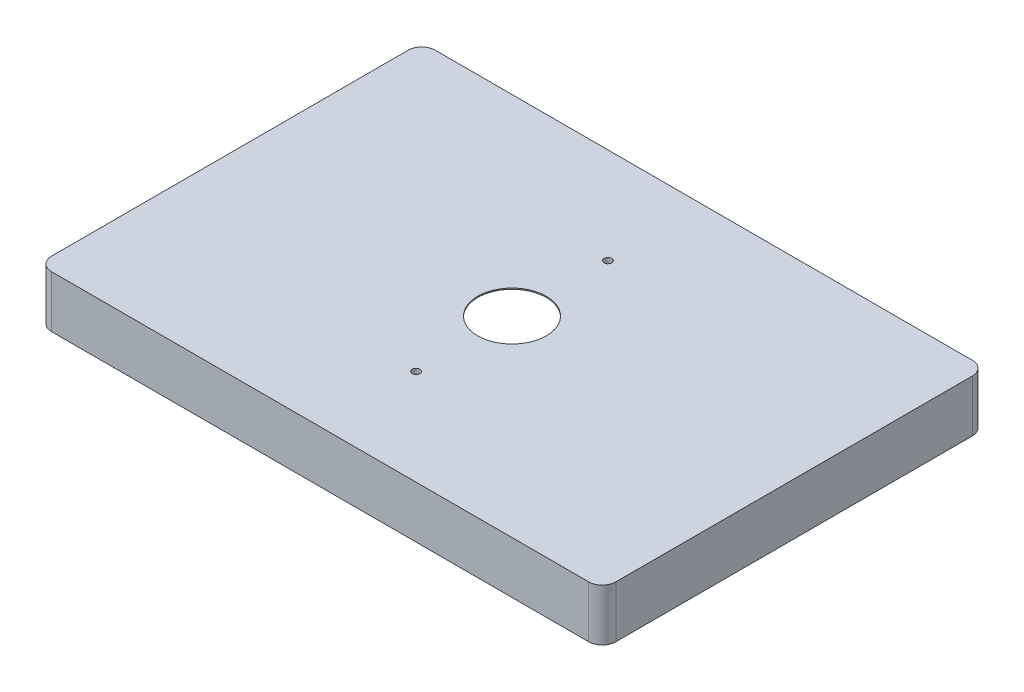
ISO-10303-21;
HEADER;
FILE_DESCRIPTION(('STEP AP214'),'2;1');
FILE_NAME('part.step','',(''),(''),'','','');
FILE_SCHEMA(('AUTOMOTIVE_DESIGN { 1 0 10303 214 1 1 1 1 }'));
ENDSEC;
DATA;
#1=APPLICATION_CONTEXT('core data for automotive mechanical design processes');
#2=APPLICATION_PROTOCOL_DEFINITION('international standard','automotive_design',2000,#1);
#3=PRODUCT_CONTEXT('',#1,'mechanical');
#4=PRODUCT('Part','Part','',(#3));
#5=PRODUCT_RELATED_PRODUCT_CATEGORY('part','',(#4));
#6=PRODUCT_DEFINITION_FORMATION('','',#4);
#7=PRODUCT_DEFINITION_CONTEXT('part definition',#1,'design');
#8=PRODUCT_DEFINITION('design','',#6,#7);
#9=PRODUCT_DEFINITION_SHAPE('','',#8);
#10=(LENGTH_UNIT() NAMED_UNIT(*) SI_UNIT(.MILLI.,.METRE.));
#11=(NAMED_UNIT(*) PLANE_ANGLE_UNIT() SI_UNIT($,.RADIAN.));
#12=(NAMED_UNIT(*) SI_UNIT($,.STERADIAN.) SOLID_ANGLE_UNIT());
#13=UNCERTAINTY_MEASURE_WITH_UNIT(LENGTH_MEASURE(1.E-05),#10,'distance_accuracy_value','');
#14=(GEOMETRIC_REPRESENTATION_CONTEXT(3) GLOBAL_UNCERTAINTY_ASSIGNED_CONTEXT((#13)) GLOBAL_UNIT_ASSIGNED_CONTEXT((#10,
#11,#12)) REPRESENTATION_CONTEXT('',''));
#15=CARTESIAN_POINT('',(0.,0.,0.));
#16=DIRECTION('',(0.,0.,1.));
#17=DIRECTION('',(1.,0.,0.));
#18=AXIS2_PLACEMENT_3D('',#15,#16,#17);
#19=CARTESIAN_POINT('',(0.,-10.,0.));
#20=DIRECTION('',(0.,1.,0.));
#21=DIRECTION('',(0.,0.,1.));
#22=AXIS2_PLACEMENT_3D('',#19,#20,#21);
#23=PLANE('',#22);
#24=CARTESIAN_POINT('',(0.,-10.,-42.5));
#25=DIRECTION('',(0.,-1.,0.));
#26=DIRECTION('',(0.,0.,-1.));
#27=AXIS2_PLACEMENT_3D('',#24,#25,#26);
#28=CIRCLE('',#27,3.36);
#29=CARTESIAN_POINT('',(0.,-10.,-45.86));
#30=VERTEX_POINT('',#29);
#31=EDGE_CURVE('E376',#30,#30,#28,.T.);
#32=ORIENTED_EDGE('',*,*,#31,.F.);
#33=EDGE_LOOP('',(#32));
#34=FACE_BOUND('',#33,.T.);
#35=CARTESIAN_POINT('',(0.,-10.,42.5));
#36=DIRECTION('',(0.,-1.,0.));
#37=DIRECTION('',(0.,0.,-1.));
#38=AXIS2_PLACEMENT_3D('',#35,#36,#37);
#39=CIRCLE('',#38,3.36);
#40=CARTESIAN_POINT('',(0.,-10.,39.14));
#41=VERTEX_POINT('',#40);
#42=EDGE_CURVE('E395',#41,#41,#39,.T.);
#43=ORIENTED_EDGE('',*,*,#42,.F.);
#44=EDGE_LOOP('',(#43));
#45=FACE_BOUND('',#44,.T.);
#46=CARTESIAN_POINT('',(4.9586776859504,-10.,0.));
#47=DIRECTION('',(0.,1.,0.));
#48=DIRECTION('',(0.,0.,1.));
#49=AXIS2_PLACEMENT_3D('',#46,#47,#48);
#50=CIRCLE('',#49,35.407046623984);
#51=CARTESIAN_POINT('',(-0.815382984620259,-10.,-34.9330670569526));
#52=VERTEX_POINT('',#51);
#53=CARTESIAN_POINT('',(-0.815382984620264,-10.,34.9330670569526));
#54=VERTEX_POINT('',#53);
#55=EDGE_CURVE('E237',#52,#54,#50,.T.);
#56=ORIENTED_EDGE('',*,*,#55,.T.);
#57=DIRECTION('',(0.986613411390535,0.,0.163076596924055));
#58=VECTOR('',#57,1.);
#59=CARTESIAN_POINT('',(-5.64218971289631,-10.,34.1352477630227));
#60=LINE('',#59,#58);
#61=CARTESIAN_POINT('',(121.,-10.,55.0678411039973));
#62=VERTEX_POINT('',#61);
#63=EDGE_CURVE('E232',#54,#62,#60,.T.);
#64=ORIENTED_EDGE('',*,*,#63,.T.);
#65=DIRECTION('',(0.,0.,1.));
#66=VECTOR('',#65,1.);
#67=CARTESIAN_POINT('',(121.,-10.,0.));
#68=LINE('',#67,#66);
#69=CARTESIAN_POINT('',(121.,-10.,79.));
#70=VERTEX_POINT('',#69);
#71=EDGE_CURVE('E236',#62,#70,#68,.T.);
#72=ORIENTED_EDGE('',*,*,#71,.T.);
#73=CARTESIAN_POINT('',(119.,-10.,79.));
#74=DIRECTION('',(0.,-1.,0.));
#75=DIRECTION('',(0.,0.,-1.));
#76=AXIS2_PLACEMENT_3D('',#73,#74,#75);
#77=CIRCLE('',#76,2.);
#78=CARTESIAN_POINT('',(119.,-10.,81.));
#79=VERTEX_POINT('',#78);
#80=EDGE_CURVE('E254',#70,#79,#77,.T.);
#81=ORIENTED_EDGE('',*,*,#80,.T.);
#82=DIRECTION('',(-1.,0.,0.));
#83=VECTOR('',#82,1.);
#84=CARTESIAN_POINT('',(0.,-10.,81.));
#85=LINE('',#84,#83);
#86=CARTESIAN_POINT('',(-119.,-10.,81.));
#87=VERTEX_POINT('',#86);
#88=EDGE_CURVE('E484',#79,#87,#85,.T.);
#89=ORIENTED_EDGE('',*,*,#88,.T.);
#90=CARTESIAN_POINT('',(-119.,-10.,79.));
#91=DIRECTION('',(0.,-1.,0.));
#92=DIRECTION('',(0.,0.,-1.));
#93=AXIS2_PLACEMENT_3D('',#90,#91,#92);
#94=CIRCLE('',#93,2.);
#95=CARTESIAN_POINT('',(-121.,-10.,79.));
#96=VERTEX_POINT('',#95);
#97=EDGE_CURVE('E483',#96,#87,#94,.F.);
#98=ORIENTED_EDGE('',*,*,#97,.F.);
#99=DIRECTION('',(0.,0.,-1.));
#100=VECTOR('',#99,1.);
#101=CARTESIAN_POINT('',(-121.,-10.,0.));
#102=LINE('',#101,#100);
#103=CARTESIAN_POINT('',(-121.,-10.,-78.9999999999999));
#104=VERTEX_POINT('',#103);
#105=EDGE_CURVE('E418',#96,#104,#102,.T.);
#106=ORIENTED_EDGE('',*,*,#105,.T.);
#107=CARTESIAN_POINT('',(-119.,-10.,-78.9999999999999));
#108=DIRECTION('',(0.,-1.,0.));
#109=DIRECTION('',(0.,0.,-1.));
#110=AXIS2_PLACEMENT_3D('',#107,#108,#109);
#111=CIRCLE('',#110,2.);
#112=CARTESIAN_POINT('',(-119.,-10.,-80.9999999999999));
#113=VERTEX_POINT('',#112);
#114=EDGE_CURVE('E423',#104,#113,#111,.T.);
#115=ORIENTED_EDGE('',*,*,#114,.T.);
#116=DIRECTION('',(1.,0.,0.));
#117=VECTOR('',#116,1.);
#118=CARTESIAN_POINT('',(0.,-10.,-81.));
#119=LINE('',#118,#117);
#120=CARTESIAN_POINT('',(119.,-10.,-81.));
#121=VERTEX_POINT('',#120);
#122=EDGE_CURVE('E495',#113,#121,#119,.T.);
#123=ORIENTED_EDGE('',*,*,#122,.T.);
#124=CARTESIAN_POINT('',(119.,-10.,-79.));
#125=DIRECTION('',(0.,-1.,0.));
#126=DIRECTION('',(0.,0.,-1.));
#127=AXIS2_PLACEMENT_3D('',#124,#125,#126);
#128=CIRCLE('',#127,2.);
#129=CARTESIAN_POINT('',(121.,-10.,-79.));
#130=VERTEX_POINT('',#129);
#131=EDGE_CURVE('E490',#121,#130,#128,.T.);
#132=ORIENTED_EDGE('',*,*,#131,.T.);
#133=CARTESIAN_POINT('',(121.,-10.,-55.0678411039973));
#134=VERTEX_POINT('',#133);
#135=EDGE_CURVE('E255',#130,#134,#68,.T.);
#136=ORIENTED_EDGE('',*,*,#135,.T.);
#137=DIRECTION('',(-0.986613411390535,0.,0.163076596924055));
#138=VECTOR('',#137,1.);
#139=CARTESIAN_POINT('',(-5.64218971289631,-10.,-34.1352477630227));
#140=LINE('',#139,#138);
#141=EDGE_CURVE('E244',#134,#52,#140,.T.);
#142=ORIENTED_EDGE('',*,*,#141,.T.);
#143=EDGE_LOOP('',(#56,#64,#72,#81,#89,#98,#106,#115,#123,#132,#136,#142));
#144=FACE_BOUND('',#143,.T.);
#145=ADVANCED_FACE('F49',(#34,#45,#144),#23,.F.);
#146=CARTESIAN_POINT('',(-125.,-10.,85.));
#147=DIRECTION('',(-1.,0.,0.));
#148=DIRECTION('',(0.,0.,1.));
#149=AXIS2_PLACEMENT_3D('',#146,#147,#148);
#150=PLANE('',#149);
#151=DIRECTION('',(0.,0.,1.));
#152=VECTOR('',#151,1.);
#153=CARTESIAN_POINT('',(-125.,0.,85.));
#154=LINE('',#153,#152);
#155=CARTESIAN_POINT('',(-125.,0.,-78.9999999999999));
#156=VERTEX_POINT('',#155);
#157=CARTESIAN_POINT('',(-125.,0.,79.));
#158=VERTEX_POINT('',#157);
#159=EDGE_CURVE('E526',#156,#158,#154,.T.);
#160=ORIENTED_EDGE('',*,*,#159,.F.);
#161=DIRECTION('',(0.,1.,0.));
#162=VECTOR('',#161,1.);
#163=CARTESIAN_POINT('',(-125.,-10.,-78.9999999999999));
#164=LINE('',#163,#162);
#165=CARTESIAN_POINT('',(-125.,-23.,-78.9999999999999));
#166=VERTEX_POINT('',#165);
#167=EDGE_CURVE('E570',#156,#166,#164,.F.);
#168=ORIENTED_EDGE('',*,*,#167,.T.);
#169=DIRECTION('',(0.,0.,-1.));
#170=VECTOR('',#169,1.);
#171=CARTESIAN_POINT('',(-125.,-23.,0.));
#172=LINE('',#171,#170);
#173=CARTESIAN_POINT('',(-125.,-23.,79.));
#174=VERTEX_POINT('',#173);
#175=EDGE_CURVE('E417',#174,#166,#172,.T.);
#176=ORIENTED_EDGE('',*,*,#175,.F.);
#177=DIRECTION('',(0.,1.,0.));
#178=VECTOR('',#177,1.);
#179=CARTESIAN_POINT('',(-125.,-10.,79.));
#180=LINE('',#179,#178);
#181=EDGE_CURVE('E563',#174,#158,#180,.T.);
#182=ORIENTED_EDGE('',*,*,#181,.T.);
#183=EDGE_LOOP('',(#160,#168,#176,#182));
#184=FACE_BOUND('',#183,.T.);
#185=ADVANCED_FACE('F624',(#184),#150,.T.);
#186=CARTESIAN_POINT('',(125.,-10.,-85.));
#187=DIRECTION('',(0.,0.,-1.));
#188=DIRECTION('',(-1.,0.,0.));
#189=AXIS2_PLACEMENT_3D('',#186,#187,#188);
#190=PLANE('',#189);
#191=DIRECTION('',(0.,1.,0.));
#192=VECTOR('',#191,1.);
#193=CARTESIAN_POINT('',(119.,-10.,-85.));
#194=LINE('',#193,#192);
#195=CARTESIAN_POINT('',(119.,0.,-85.));
#196=VERTEX_POINT('',#195);
#197=CARTESIAN_POINT('',(119.,-23.,-85.));
#198=VERTEX_POINT('',#197);
#199=EDGE_CURVE('E544',#196,#198,#194,.F.);
#200=ORIENTED_EDGE('',*,*,#199,.T.);
#201=DIRECTION('',(1.,0.,0.));
#202=VECTOR('',#201,1.);
#203=CARTESIAN_POINT('',(0.,-23.,-85.));
#204=LINE('',#203,#202);
#205=CARTESIAN_POINT('',(-119.,-23.,-85.));
#206=VERTEX_POINT('',#205);
#207=EDGE_CURVE('E426',#206,#198,#204,.T.);
#208=ORIENTED_EDGE('',*,*,#207,.F.);
#209=DIRECTION('',(0.,1.,0.));
#210=VECTOR('',#209,1.);
#211=CARTESIAN_POINT('',(-119.,-10.,-85.));
#212=LINE('',#211,#210);
#213=CARTESIAN_POINT('',(-119.,0.,-85.));
#214=VERTEX_POINT('',#213);
#215=EDGE_CURVE('E550',#206,#214,#212,.T.);
#216=ORIENTED_EDGE('',*,*,#215,.T.);
#217=DIRECTION('',(-1.,0.,0.));
#218=VECTOR('',#217,1.);
#219=CARTESIAN_POINT('',(125.,0.,-85.));
#220=LINE('',#219,#218);
#221=EDGE_CURVE('E538',#196,#214,#220,.T.);
#222=ORIENTED_EDGE('',*,*,#221,.F.);
#223=EDGE_LOOP('',(#200,#208,#216,#222));
#224=FACE_BOUND('',#223,.T.);
#225=ADVANCED_FACE('F627',(#224),#190,.T.);
#226=CARTESIAN_POINT('',(125.,-10.,85.));
#227=DIRECTION('',(1.,0.,0.));
#228=DIRECTION('',(0.,0.,-1.));
#229=AXIS2_PLACEMENT_3D('',#226,#227,#228);
#230=PLANE('',#229);
#231=DIRECTION('',(0.,0.,-1.));
#232=VECTOR('',#231,1.);
#233=CARTESIAN_POINT('',(125.,0.,85.));
#234=LINE('',#233,#232);
#235=CARTESIAN_POINT('',(125.,0.,79.));
#236=VERTEX_POINT('',#235);
#237=CARTESIAN_POINT('',(125.,0.,-79.));
#238=VERTEX_POINT('',#237);
#239=EDGE_CURVE('E537',#236,#238,#234,.T.);
#240=ORIENTED_EDGE('',*,*,#239,.F.);
#241=DIRECTION('',(0.,1.,0.));
#242=VECTOR('',#241,1.);
#243=CARTESIAN_POINT('',(125.,-10.,79.));
#244=LINE('',#243,#242);
#245=CARTESIAN_POINT('',(125.,-23.,79.));
#246=VERTEX_POINT('',#245);
#247=EDGE_CURVE('E582',#236,#246,#244,.F.);
#248=ORIENTED_EDGE('',*,*,#247,.T.);
#249=DIRECTION('',(0.,0.,1.));
#250=VECTOR('',#249,1.);
#251=CARTESIAN_POINT('',(125.,-23.,0.));
#252=LINE('',#251,#250);
#253=CARTESIAN_POINT('',(125.,-23.,-79.));
#254=VERTEX_POINT('',#253);
#255=EDGE_CURVE('E436',#254,#246,#252,.T.);
#256=ORIENTED_EDGE('',*,*,#255,.F.);
#257=DIRECTION('',(0.,1.,0.));
#258=VECTOR('',#257,1.);
#259=CARTESIAN_POINT('',(125.,-10.,-79.));
#260=LINE('',#259,#258);
#261=EDGE_CURVE('E580',#254,#238,#260,.T.);
#262=ORIENTED_EDGE('',*,*,#261,.T.);
#263=EDGE_LOOP('',(#240,#248,#256,#262));
#264=FACE_BOUND('',#263,.T.);
#265=ADVANCED_FACE('F643',(#264),#230,.T.);
#266=CARTESIAN_POINT('',(125.,-10.,85.));
#267=DIRECTION('',(0.,0.,1.));
#268=DIRECTION('',(1.,0.,0.));
#269=AXIS2_PLACEMENT_3D('',#266,#267,#268);
#270=PLANE('',#269);
#271=DIRECTION('',(1.,0.,0.));
#272=VECTOR('',#271,1.);
#273=CARTESIAN_POINT('',(125.,0.,85.));
#274=LINE('',#273,#272);
#275=CARTESIAN_POINT('',(-119.,0.,85.));
#276=VERTEX_POINT('',#275);
#277=CARTESIAN_POINT('',(119.,0.,85.));
#278=VERTEX_POINT('',#277);
#279=EDGE_CURVE('E535',#276,#278,#274,.T.);
#280=ORIENTED_EDGE('',*,*,#279,.F.);
#281=DIRECTION('',(0.,1.,0.));
#282=VECTOR('',#281,1.);
#283=CARTESIAN_POINT('',(-119.,-10.,85.));
#284=LINE('',#283,#282);
#285=CARTESIAN_POINT('',(-119.,-23.,85.));
#286=VERTEX_POINT('',#285);
#287=EDGE_CURVE('E573',#276,#286,#284,.F.);
#288=ORIENTED_EDGE('',*,*,#287,.T.);
#289=DIRECTION('',(-1.,0.,0.));
#290=VECTOR('',#289,1.);
#291=CARTESIAN_POINT('',(0.,-23.,85.));
#292=LINE('',#291,#290);
#293=CARTESIAN_POINT('',(119.,-23.,85.));
#294=VERTEX_POINT('',#293);
#295=EDGE_CURVE('E443',#294,#286,#292,.T.);
#296=ORIENTED_EDGE('',*,*,#295,.F.);
#297=DIRECTION('',(0.,1.,0.));
#298=VECTOR('',#297,1.);
#299=CARTESIAN_POINT('',(119.,-10.,85.));
#300=LINE('',#299,#298);
#301=EDGE_CURVE('E569',#294,#278,#300,.T.);
#302=ORIENTED_EDGE('',*,*,#301,.T.);
#303=EDGE_LOOP('',(#280,#288,#296,#302));
#304=FACE_BOUND('',#303,.T.);
#305=ADVANCED_FACE('F642',(#304),#270,.T.);
#306=CARTESIAN_POINT('',(0.,0.,0.));
#307=DIRECTION('',(0.,1.,0.));
#308=DIRECTION('',(0.,0.,1.));
#309=AXIS2_PLACEMENT_3D('',#306,#307,#308);
#310=PLANE('',#309);
#311=CARTESIAN_POINT('',(0.,0.,-42.5));
#312=DIRECTION('',(0.,-1.,0.));
#313=DIRECTION('',(0.,0.,-1.));
#314=AXIS2_PLACEMENT_3D('',#311,#312,#313);
#315=CIRCLE('',#314,1.7);
#316=CARTESIAN_POINT('',(0.,0.,-44.2));
#317=VERTEX_POINT('',#316);
#318=EDGE_CURVE('E389',#317,#317,#315,.T.);
#319=ORIENTED_EDGE('',*,*,#318,.T.);
#320=EDGE_LOOP('',(#319));
#321=FACE_BOUND('',#320,.T.);
#322=CARTESIAN_POINT('',(0.,0.,42.5));
#323=DIRECTION('',(0.,-1.,0.));
#324=DIRECTION('',(0.,0.,-1.));
#325=AXIS2_PLACEMENT_3D('',#322,#323,#324);
#326=CIRCLE('',#325,1.7);
#327=CARTESIAN_POINT('',(0.,0.,40.8));
#328=VERTEX_POINT('',#327);
#329=EDGE_CURVE('E404',#328,#328,#326,.T.);
#330=ORIENTED_EDGE('',*,*,#329,.T.);
#331=EDGE_LOOP('',(#330));
#332=FACE_BOUND('',#331,.T.);
#333=CARTESIAN_POINT('',(0.,0.,0.));
#334=DIRECTION('',(0.,1.,0.));
#335=DIRECTION('',(0.,0.,1.));
#336=AXIS2_PLACEMENT_3D('',#333,#334,#335);
#337=CIRCLE('',#336,15.2);
#338=CARTESIAN_POINT('',(0.,0.,15.2));
#339=VERTEX_POINT('',#338);
#340=EDGE_CURVE('E524',#339,#339,#337,.T.);
#341=ORIENTED_EDGE('',*,*,#340,.F.);
#342=EDGE_LOOP('',(#341));
#343=FACE_BOUND('',#342,.T.);
#344=ORIENTED_EDGE('',*,*,#221,.T.);
#345=CARTESIAN_POINT('',(-119.,0.,-78.9999999999999));
#346=DIRECTION('',(0.,1.,0.));
#347=DIRECTION('',(0.,0.,1.));
#348=AXIS2_PLACEMENT_3D('',#345,#346,#347);
#349=CIRCLE('',#348,6.);
#350=EDGE_CURVE('E557',#214,#156,#349,.T.);
#351=ORIENTED_EDGE('',*,*,#350,.T.);
#352=ORIENTED_EDGE('',*,*,#159,.T.);
#353=CARTESIAN_POINT('',(-119.,0.,79.));
#354=DIRECTION('',(0.,1.,0.));
#355=DIRECTION('',(0.,0.,1.));
#356=AXIS2_PLACEMENT_3D('',#353,#354,#355);
#357=CIRCLE('',#356,6.);
#358=EDGE_CURVE('E560',#158,#276,#357,.T.);
#359=ORIENTED_EDGE('',*,*,#358,.T.);
#360=ORIENTED_EDGE('',*,*,#279,.T.);
#361=CARTESIAN_POINT('',(119.,0.,79.));
#362=DIRECTION('',(0.,1.,0.));
#363=DIRECTION('',(0.,0.,1.));
#364=AXIS2_PLACEMENT_3D('',#361,#362,#363);
#365=CIRCLE('',#364,6.);
#366=EDGE_CURVE('E555',#278,#236,#365,.T.);
#367=ORIENTED_EDGE('',*,*,#366,.T.);
#368=ORIENTED_EDGE('',*,*,#239,.T.);
#369=CARTESIAN_POINT('',(119.,0.,-79.));
#370=DIRECTION('',(0.,1.,0.));
#371=DIRECTION('',(0.,0.,1.));
#372=AXIS2_PLACEMENT_3D('',#369,#370,#371);
#373=CIRCLE('',#372,6.);
#374=EDGE_CURVE('E553',#238,#196,#373,.T.);
#375=ORIENTED_EDGE('',*,*,#374,.T.);
#376=EDGE_LOOP('',(#344,#351,#352,#359,#360,#367,#368,#375));
#377=FACE_BOUND('',#376,.T.);
#378=ADVANCED_FACE('F637',(#321,#332,#343,#377),#310,.T.);
#379=CARTESIAN_POINT('',(0.,-10.,0.));
#380=DIRECTION('',(0.,1.,0.));
#381=DIRECTION('',(0.,0.,1.));
#382=AXIS2_PLACEMENT_3D('',#379,#380,#381);
#383=CYLINDRICAL_SURFACE('',#382,15.2);
#384=CARTESIAN_POINT('',(0.,-0.499999999999999,0.));
#385=DIRECTION('',(0.,1.,0.));
#386=DIRECTION('',(0.,0.,1.));
#387=AXIS2_PLACEMENT_3D('',#384,#385,#386);
#388=CIRCLE('',#387,15.2);
#389=CARTESIAN_POINT('',(0.,-0.499999999999999,15.2));
#390=VERTEX_POINT('',#389);
#391=EDGE_CURVE('E581',#390,#390,#388,.F.);
#392=ORIENTED_EDGE('',*,*,#391,.T.);
#393=EDGE_LOOP('',(#392));
#394=FACE_BOUND('',#393,.T.);
#395=ORIENTED_EDGE('',*,*,#340,.T.);
#396=EDGE_LOOP('',(#395));
#397=FACE_BOUND('',#396,.T.);
#398=ADVANCED_FACE('F636',(#394,#397),#383,.F.);
#399=CARTESIAN_POINT('',(-119.,-10.,-78.9999999999999));
#400=DIRECTION('',(0.,1.,0.));
#401=DIRECTION('',(0.,0.,1.));
#402=AXIS2_PLACEMENT_3D('',#399,#400,#401);
#403=CYLINDRICAL_SURFACE('',#402,6.);
#404=ORIENTED_EDGE('',*,*,#215,.F.);
#405=CARTESIAN_POINT('',(-119.,-23.,-78.9999999999999));
#406=DIRECTION('',(0.,-1.,0.));
#407=DIRECTION('',(0.,0.,-1.));
#408=AXIS2_PLACEMENT_3D('',#405,#406,#407);
#409=CIRCLE('',#408,6.);
#410=EDGE_CURVE('E425',#166,#206,#409,.T.);
#411=ORIENTED_EDGE('',*,*,#410,.F.);
#412=ORIENTED_EDGE('',*,*,#167,.F.);
#413=ORIENTED_EDGE('',*,*,#350,.F.);
#414=EDGE_LOOP('',(#404,#411,#412,#413));
#415=FACE_BOUND('',#414,.T.);
#416=ADVANCED_FACE('F653',(#415),#403,.T.);
#417=CARTESIAN_POINT('',(-119.,-10.,79.));
#418=DIRECTION('',(0.,1.,0.));
#419=DIRECTION('',(0.,0.,1.));
#420=AXIS2_PLACEMENT_3D('',#417,#418,#419);
#421=CYLINDRICAL_SURFACE('',#420,6.);
#422=ORIENTED_EDGE('',*,*,#181,.F.);
#423=CARTESIAN_POINT('',(-119.,-23.,79.));
#424=DIRECTION('',(0.,-1.,0.));
#425=DIRECTION('',(0.,0.,-1.));
#426=AXIS2_PLACEMENT_3D('',#423,#424,#425);
#427=CIRCLE('',#426,6.);
#428=EDGE_CURVE('E420',#286,#174,#427,.T.);
#429=ORIENTED_EDGE('',*,*,#428,.F.);
#430=ORIENTED_EDGE('',*,*,#287,.F.);
#431=ORIENTED_EDGE('',*,*,#358,.F.);
#432=EDGE_LOOP('',(#422,#429,#430,#431));
#433=FACE_BOUND('',#432,.T.);
#434=ADVANCED_FACE('F658',(#433),#421,.T.);
#435=CARTESIAN_POINT('',(119.,-10.,79.));
#436=DIRECTION('',(0.,1.,0.));
#437=DIRECTION('',(0.,0.,1.));
#438=AXIS2_PLACEMENT_3D('',#435,#436,#437);
#439=CYLINDRICAL_SURFACE('',#438,6.);
#440=ORIENTED_EDGE('',*,*,#301,.F.);
#441=CARTESIAN_POINT('',(119.,-23.,79.));
#442=DIRECTION('',(0.,-1.,0.));
#443=DIRECTION('',(0.,0.,-1.));
#444=AXIS2_PLACEMENT_3D('',#441,#442,#443);
#445=CIRCLE('',#444,6.);
#446=EDGE_CURVE('E439',#246,#294,#445,.T.);
#447=ORIENTED_EDGE('',*,*,#446,.F.);
#448=ORIENTED_EDGE('',*,*,#247,.F.);
#449=ORIENTED_EDGE('',*,*,#366,.F.);
#450=EDGE_LOOP('',(#440,#447,#448,#449));
#451=FACE_BOUND('',#450,.T.);
#452=ADVANCED_FACE('F657',(#451),#439,.T.);
#453=CARTESIAN_POINT('',(119.,-10.,-79.));
#454=DIRECTION('',(0.,1.,0.));
#455=DIRECTION('',(0.,0.,1.));
#456=AXIS2_PLACEMENT_3D('',#453,#454,#455);
#457=CYLINDRICAL_SURFACE('',#456,6.);
#458=ORIENTED_EDGE('',*,*,#261,.F.);
#459=CARTESIAN_POINT('',(119.,-23.,-79.));
#460=DIRECTION('',(0.,-1.,0.));
#461=DIRECTION('',(0.,0.,-1.));
#462=AXIS2_PLACEMENT_3D('',#459,#460,#461);
#463=CIRCLE('',#462,6.);
#464=EDGE_CURVE('E435',#198,#254,#463,.T.);
#465=ORIENTED_EDGE('',*,*,#464,.F.);
#466=ORIENTED_EDGE('',*,*,#199,.F.);
#467=ORIENTED_EDGE('',*,*,#374,.F.);
#468=EDGE_LOOP('',(#458,#465,#466,#467));
#469=FACE_BOUND('',#468,.T.);
#470=ADVANCED_FACE('F664',(#469),#457,.T.);
#471=CARTESIAN_POINT('',(-121.,-23.,0.));
#472=DIRECTION('',(1.,0.,0.));
#473=DIRECTION('',(0.,0.,-1.));
#474=AXIS2_PLACEMENT_3D('',#471,#472,#473);
#475=PLANE('',#474);
#476=ORIENTED_EDGE('',*,*,#105,.F.);
#477=DIRECTION('',(0.,1.,0.));
#478=VECTOR('',#477,1.);
#479=CARTESIAN_POINT('',(-121.,-23.,79.));
#480=LINE('',#479,#478);
#481=CARTESIAN_POINT('',(-121.,-23.,79.));
#482=VERTEX_POINT('',#481);
#483=EDGE_CURVE('E518',#482,#96,#480,.T.);
#484=ORIENTED_EDGE('',*,*,#483,.F.);
#485=DIRECTION('',(0.,0.,-1.));
#486=VECTOR('',#485,1.);
#487=CARTESIAN_POINT('',(-121.,-23.,0.));
#488=LINE('',#487,#486);
#489=CARTESIAN_POINT('',(-121.,-23.,-78.9999999999999));
#490=VERTEX_POINT('',#489);
#491=EDGE_CURVE('E449',#482,#490,#488,.T.);
#492=ORIENTED_EDGE('',*,*,#491,.T.);
#493=DIRECTION('',(0.,1.,0.));
#494=VECTOR('',#493,1.);
#495=CARTESIAN_POINT('',(-121.,-23.,-78.9999999999999));
#496=LINE('',#495,#494);
#497=EDGE_CURVE('E478',#490,#104,#496,.T.);
#498=ORIENTED_EDGE('',*,*,#497,.T.);
#499=EDGE_LOOP('',(#476,#484,#492,#498));
#500=FACE_BOUND('',#499,.T.);
#501=ADVANCED_FACE('F670',(#500),#475,.T.);
#502=CARTESIAN_POINT('',(-119.,-23.,79.));
#503=DIRECTION('',(0.,1.,0.));
#504=DIRECTION('',(0.,0.,1.));
#505=AXIS2_PLACEMENT_3D('',#502,#503,#504);
#506=CYLINDRICAL_SURFACE('',#505,2.);
#507=ORIENTED_EDGE('',*,*,#97,.T.);
#508=DIRECTION('',(0.,1.,0.));
#509=VECTOR('',#508,1.);
#510=CARTESIAN_POINT('',(-119.,-23.,81.));
#511=LINE('',#510,#509);
#512=CARTESIAN_POINT('',(-119.,-23.,81.));
#513=VERTEX_POINT('',#512);
#514=EDGE_CURVE('E517',#513,#87,#511,.T.);
#515=ORIENTED_EDGE('',*,*,#514,.F.);
#516=CARTESIAN_POINT('',(-119.,-23.,79.));
#517=DIRECTION('',(0.,-1.,0.));
#518=DIRECTION('',(0.,0.,-1.));
#519=AXIS2_PLACEMENT_3D('',#516,#517,#518);
#520=CIRCLE('',#519,2.);
#521=EDGE_CURVE('E455',#482,#513,#520,.F.);
#522=ORIENTED_EDGE('',*,*,#521,.F.);
#523=ORIENTED_EDGE('',*,*,#483,.T.);
#524=EDGE_LOOP('',(#507,#515,#522,#523));
#525=FACE_BOUND('',#524,.T.);
#526=ADVANCED_FACE('F817',(#525),#506,.F.);
#527=CARTESIAN_POINT('',(0.,-23.,81.));
#528=DIRECTION('',(0.,0.,-1.));
#529=DIRECTION('',(-1.,0.,0.));
#530=AXIS2_PLACEMENT_3D('',#527,#528,#529);
#531=PLANE('',#530);
#532=ORIENTED_EDGE('',*,*,#88,.F.);
#533=DIRECTION('',(0.,1.,0.));
#534=VECTOR('',#533,1.);
#535=CARTESIAN_POINT('',(119.,-23.,81.));
#536=LINE('',#535,#534);
#537=CARTESIAN_POINT('',(119.,-23.,81.));
#538=VERTEX_POINT('',#537);
#539=EDGE_CURVE('E515',#538,#79,#536,.T.);
#540=ORIENTED_EDGE('',*,*,#539,.F.);
#541=DIRECTION('',(-1.,0.,0.));
#542=VECTOR('',#541,1.);
#543=CARTESIAN_POINT('',(0.,-23.,81.));
#544=LINE('',#543,#542);
#545=EDGE_CURVE('E453',#538,#513,#544,.T.);
#546=ORIENTED_EDGE('',*,*,#545,.T.);
#547=ORIENTED_EDGE('',*,*,#514,.T.);
#548=EDGE_LOOP('',(#532,#540,#546,#547));
#549=FACE_BOUND('',#548,.T.);
#550=ADVANCED_FACE('F826',(#549),#531,.T.);
#551=CARTESIAN_POINT('',(119.,-23.,79.));
#552=DIRECTION('',(0.,1.,0.));
#553=DIRECTION('',(0.,0.,1.));
#554=AXIS2_PLACEMENT_3D('',#551,#552,#553);
#555=CYLINDRICAL_SURFACE('',#554,2.);
#556=ORIENTED_EDGE('',*,*,#80,.F.);
#557=DIRECTION('',(0.,1.,0.));
#558=VECTOR('',#557,1.);
#559=CARTESIAN_POINT('',(121.,-23.,79.));
#560=LINE('',#559,#558);
#561=CARTESIAN_POINT('',(121.,-23.,79.));
#562=VERTEX_POINT('',#561);
#563=EDGE_CURVE('E248',#562,#70,#560,.T.);
#564=ORIENTED_EDGE('',*,*,#563,.F.);
#565=CARTESIAN_POINT('',(119.,-23.,79.));
#566=DIRECTION('',(0.,-1.,0.));
#567=DIRECTION('',(0.,0.,-1.));
#568=AXIS2_PLACEMENT_3D('',#565,#566,#567);
#569=CIRCLE('',#568,2.);
#570=EDGE_CURVE('E459',#562,#538,#569,.T.);
#571=ORIENTED_EDGE('',*,*,#570,.T.);
#572=ORIENTED_EDGE('',*,*,#539,.T.);
#573=EDGE_LOOP('',(#556,#564,#571,#572));
#574=FACE_BOUND('',#573,.T.);
#575=ADVANCED_FACE('F832',(#574),#555,.F.);
#576=CARTESIAN_POINT('',(121.,-23.,0.));
#577=DIRECTION('',(-1.,0.,0.));
#578=DIRECTION('',(0.,0.,1.));
#579=AXIS2_PLACEMENT_3D('',#576,#577,#578);
#580=PLANE('',#579);
#581=DIRECTION('',(0.,0.844763013314967,0.535140590251774));
#582=VECTOR('',#581,1.);
#583=CARTESIAN_POINT('',(121.,-10.,55.0678411039973));
#584=LINE('',#583,#582);
#585=CARTESIAN_POINT('',(121.,-17.3425895181373,50.4164564827728));
#586=VERTEX_POINT('',#585);
#587=EDGE_CURVE('E221',#586,#62,#584,.T.);
#588=ORIENTED_EDGE('',*,*,#587,.F.);
#589=CARTESIAN_POINT('',(121.,-15.1715728752538,48.4435623447032));
#590=DIRECTION('',(-1.,0.,0.));
#591=DIRECTION('',(0.,-0.876110892025599,0.482109639889216));
#592=AXIS2_PLACEMENT_3D('',#589,#590,#591);
#593=ELLIPSE('',#592,3.03500396826971,2.);
#594=CARTESIAN_POINT('',(121.,-18.,49.2217811723516));
#595=VERTEX_POINT('',#594);
#596=EDGE_CURVE('E11',#586,#595,#593,.F.);
#597=ORIENTED_EDGE('',*,*,#596,.T.);
#598=DIRECTION('',(0.,0.,1.));
#599=VECTOR('',#598,1.);
#600=CARTESIAN_POINT('',(121.,-18.,-50.));
#601=LINE('',#600,#599);
#602=CARTESIAN_POINT('',(121.,-18.,-49.2217811723516));
#603=VERTEX_POINT('',#602);
#604=EDGE_CURVE('E332',#603,#595,#601,.T.);
#605=ORIENTED_EDGE('',*,*,#604,.F.);
#606=CARTESIAN_POINT('',(121.,-15.1715728752538,-48.4435623447032));
#607=DIRECTION('',(-1.,0.,0.));
#608=DIRECTION('',(0.,-0.876110892025597,-0.482109639889219));
#609=AXIS2_PLACEMENT_3D('',#606,#607,#608);
#610=ELLIPSE('',#609,3.03500396826971,2.);
#611=CARTESIAN_POINT('',(121.,-17.3425895181373,-50.4164564827728));
#612=VERTEX_POINT('',#611);
#613=EDGE_CURVE('E58',#603,#612,#610,.F.);
#614=ORIENTED_EDGE('',*,*,#613,.T.);
#615=DIRECTION('',(0.,-0.844763013314966,0.535140590251775));
#616=VECTOR('',#615,1.);
#617=CARTESIAN_POINT('',(121.,-18.,-50.));
#618=LINE('',#617,#616);
#619=EDGE_CURVE('E233',#134,#612,#618,.T.);
#620=ORIENTED_EDGE('',*,*,#619,.F.);
#621=ORIENTED_EDGE('',*,*,#135,.F.);
#622=DIRECTION('',(0.,1.,0.));
#623=VECTOR('',#622,1.);
#624=CARTESIAN_POINT('',(121.,-23.,-79.));
#625=LINE('',#624,#623);
#626=CARTESIAN_POINT('',(121.,-23.,-79.));
#627=VERTEX_POINT('',#626);
#628=EDGE_CURVE('E506',#627,#130,#625,.T.);
#629=ORIENTED_EDGE('',*,*,#628,.F.);
#630=DIRECTION('',(0.,0.,1.));
#631=VECTOR('',#630,1.);
#632=CARTESIAN_POINT('',(121.,-23.,0.));
#633=LINE('',#632,#631);
#634=EDGE_CURVE('E461',#627,#562,#633,.T.);
#635=ORIENTED_EDGE('',*,*,#634,.T.);
#636=ORIENTED_EDGE('',*,*,#563,.T.);
#637=ORIENTED_EDGE('',*,*,#71,.F.);
#638=EDGE_LOOP('',(#588,#597,#605,#614,#620,#621,#629,#635,#636,#637));
#639=FACE_BOUND('',#638,.T.);
#640=ADVANCED_FACE('F250',(#639),#580,.T.);
#641=CARTESIAN_POINT('',(119.,-23.,-79.));
#642=DIRECTION('',(0.,1.,0.));
#643=DIRECTION('',(0.,0.,1.));
#644=AXIS2_PLACEMENT_3D('',#641,#642,#643);
#645=CYLINDRICAL_SURFACE('',#644,2.);
#646=ORIENTED_EDGE('',*,*,#131,.F.);
#647=DIRECTION('',(0.,1.,0.));
#648=VECTOR('',#647,1.);
#649=CARTESIAN_POINT('',(119.,-23.,-81.));
#650=LINE('',#649,#648);
#651=CARTESIAN_POINT('',(119.,-23.,-81.));
#652=VERTEX_POINT('',#651);
#653=EDGE_CURVE('E505',#652,#121,#650,.T.);
#654=ORIENTED_EDGE('',*,*,#653,.F.);
#655=CARTESIAN_POINT('',(119.,-23.,-79.));
#656=DIRECTION('',(0.,-1.,0.));
#657=DIRECTION('',(0.,0.,-1.));
#658=AXIS2_PLACEMENT_3D('',#655,#656,#657);
#659=CIRCLE('',#658,2.);
#660=EDGE_CURVE('E467',#652,#627,#659,.T.);
#661=ORIENTED_EDGE('',*,*,#660,.T.);
#662=ORIENTED_EDGE('',*,*,#628,.T.);
#663=EDGE_LOOP('',(#646,#654,#661,#662));
#664=FACE_BOUND('',#663,.T.);
#665=ADVANCED_FACE('F850',(#664),#645,.F.);
#666=CARTESIAN_POINT('',(0.,-23.,-81.));
#667=DIRECTION('',(0.,0.,1.));
#668=DIRECTION('',(1.,0.,0.));
#669=AXIS2_PLACEMENT_3D('',#666,#667,#668);
#670=PLANE('',#669);
#671=ORIENTED_EDGE('',*,*,#122,.F.);
#672=DIRECTION('',(0.,1.,0.));
#673=VECTOR('',#672,1.);
#674=CARTESIAN_POINT('',(-119.,-23.,-80.9999999999999));
#675=LINE('',#674,#673);
#676=CARTESIAN_POINT('',(-119.,-23.,-80.9999999999999));
#677=VERTEX_POINT('',#676);
#678=EDGE_CURVE('E497',#677,#113,#675,.T.);
#679=ORIENTED_EDGE('',*,*,#678,.F.);
#680=DIRECTION('',(1.,0.,0.));
#681=VECTOR('',#680,1.);
#682=CARTESIAN_POINT('',(0.,-23.,-81.));
#683=LINE('',#682,#681);
#684=EDGE_CURVE('E468',#677,#652,#683,.T.);
#685=ORIENTED_EDGE('',*,*,#684,.T.);
#686=ORIENTED_EDGE('',*,*,#653,.T.);
#687=EDGE_LOOP('',(#671,#679,#685,#686));
#688=FACE_BOUND('',#687,.T.);
#689=ADVANCED_FACE('F855',(#688),#670,.T.);
#690=CARTESIAN_POINT('',(-119.,-23.,-78.9999999999999));
#691=DIRECTION('',(0.,1.,0.));
#692=DIRECTION('',(0.,0.,1.));
#693=AXIS2_PLACEMENT_3D('',#690,#691,#692);
#694=CYLINDRICAL_SURFACE('',#693,2.);
#695=ORIENTED_EDGE('',*,*,#114,.F.);
#696=ORIENTED_EDGE('',*,*,#497,.F.);
#697=CARTESIAN_POINT('',(-119.,-23.,-78.9999999999999));
#698=DIRECTION('',(0.,-1.,0.));
#699=DIRECTION('',(0.,0.,-1.));
#700=AXIS2_PLACEMENT_3D('',#697,#698,#699);
#701=CIRCLE('',#700,2.);
#702=EDGE_CURVE('E471',#490,#677,#701,.T.);
#703=ORIENTED_EDGE('',*,*,#702,.T.);
#704=ORIENTED_EDGE('',*,*,#678,.T.);
#705=EDGE_LOOP('',(#695,#696,#703,#704));
#706=FACE_BOUND('',#705,.T.);
#707=ADVANCED_FACE('F620',(#706),#694,.F.);
#708=CARTESIAN_POINT('',(0.,-23.,0.));
#709=DIRECTION('',(0.,-1.,0.));
#710=DIRECTION('',(0.,0.,-1.));
#711=AXIS2_PLACEMENT_3D('',#708,#709,#710);
#712=PLANE('',#711);
#713=ORIENTED_EDGE('',*,*,#428,.T.);
#714=ORIENTED_EDGE('',*,*,#175,.T.);
#715=ORIENTED_EDGE('',*,*,#410,.T.);
#716=ORIENTED_EDGE('',*,*,#207,.T.);
#717=ORIENTED_EDGE('',*,*,#464,.T.);
#718=ORIENTED_EDGE('',*,*,#255,.T.);
#719=ORIENTED_EDGE('',*,*,#446,.T.);
#720=ORIENTED_EDGE('',*,*,#295,.T.);
#721=EDGE_LOOP('',(#713,#714,#715,#716,#717,#718,#719,#720));
#722=FACE_BOUND('',#721,.T.);
#723=ORIENTED_EDGE('',*,*,#491,.F.);
#724=ORIENTED_EDGE('',*,*,#521,.T.);
#725=ORIENTED_EDGE('',*,*,#545,.F.);
#726=ORIENTED_EDGE('',*,*,#570,.F.);
#727=ORIENTED_EDGE('',*,*,#634,.F.);
#728=ORIENTED_EDGE('',*,*,#660,.F.);
#729=ORIENTED_EDGE('',*,*,#684,.F.);
#730=ORIENTED_EDGE('',*,*,#702,.F.);
#731=EDGE_LOOP('',(#723,#724,#725,#726,#727,#728,#729,#730));
#732=FACE_BOUND('',#731,.T.);
#733=ADVANCED_FACE('F606',(#722,#732),#712,.T.);
#734=CARTESIAN_POINT('',(4.9586776859504,-2.,0.));
#735=DIRECTION('',(0.,1.,0.));
#736=DIRECTION('',(0.,0.,1.));
#737=AXIS2_PLACEMENT_3D('',#734,#735,#736);
#738=PLANE('',#737);
#739=CARTESIAN_POINT('',(0.,-2.,0.));
#740=DIRECTION('',(0.,1.,0.));
#741=DIRECTION('',(0.,0.,1.));
#742=AXIS2_PLACEMENT_3D('',#739,#740,#741);
#743=CIRCLE('',#742,20.2000000000001);
#744=CARTESIAN_POINT('',(0.,-2.,20.2000000000001));
#745=VERTEX_POINT('',#744);
#746=EDGE_CURVE('E588',#745,#745,#743,.T.);
#747=ORIENTED_EDGE('',*,*,#746,.T.);
#748=EDGE_LOOP('',(#747));
#749=FACE_BOUND('',#748,.T.);
#750=DIRECTION('',(0.986613411390535,0.,-0.163076596924055));
#751=VECTOR('',#750,1.);
#752=CARTESIAN_POINT('',(121.,-2.,-50.));
#753=LINE('',#752,#751);
#754=CARTESIAN_POINT('',(0.,-2.,-30.));
#755=VERTEX_POINT('',#754);
#756=CARTESIAN_POINT('',(121.,-2.,-50.));
#757=VERTEX_POINT('',#756);
#758=EDGE_CURVE('E413',#755,#757,#753,.T.);
#759=ORIENTED_EDGE('',*,*,#758,.T.);
#760=DIRECTION('',(0.,0.,-1.));
#761=VECTOR('',#760,1.);
#762=CARTESIAN_POINT('',(121.,-2.,50.));
#763=LINE('',#762,#761);
#764=CARTESIAN_POINT('',(121.,-2.,50.));
#765=VERTEX_POINT('',#764);
#766=EDGE_CURVE('E277',#757,#765,#763,.F.);
#767=ORIENTED_EDGE('',*,*,#766,.T.);
#768=DIRECTION('',(-0.986613411390535,0.,-0.163076596924055));
#769=VECTOR('',#768,1.);
#770=CARTESIAN_POINT('',(121.,-2.,50.));
#771=LINE('',#770,#769);
#772=CARTESIAN_POINT('',(0.,-2.,30.));
#773=VERTEX_POINT('',#772);
#774=EDGE_CURVE('E256',#765,#773,#771,.T.);
#775=ORIENTED_EDGE('',*,*,#774,.T.);
#776=CARTESIAN_POINT('',(4.9586776859504,-2.,0.));
#777=DIRECTION('',(0.,-1.,0.));
#778=DIRECTION('',(0.,0.,1.));
#779=AXIS2_PLACEMENT_3D('',#776,#777,#778);
#780=CIRCLE('',#779,30.4070466239841);
#781=EDGE_CURVE('E408',#773,#755,#780,.T.);
#782=ORIENTED_EDGE('',*,*,#781,.T.);
#783=EDGE_LOOP('',(#759,#767,#775,#782));
#784=FACE_BOUND('',#783,.T.);
#785=ADVANCED_FACE('F610',(#749,#784),#738,.F.);
#786=CARTESIAN_POINT('',(0.,-0.499999999999999,0.));
#787=DIRECTION('',(0.,-1.,0.));
#788=DIRECTION('',(0.,0.,-1.));
#789=AXIS2_PLACEMENT_3D('',#786,#787,#788);
#790=CONICAL_SURFACE('',#789,15.2,1.27933953231703);
#791=ORIENTED_EDGE('',*,*,#746,.F.);
#792=EDGE_LOOP('',(#791));
#793=FACE_BOUND('',#792,.T.);
#794=ORIENTED_EDGE('',*,*,#391,.F.);
#795=EDGE_LOOP('',(#794));
#796=FACE_BOUND('',#795,.T.);
#797=ADVANCED_FACE('F609',(#793,#796),#790,.F.);
#798=CARTESIAN_POINT('',(0.,-10.,42.5));
#799=DIRECTION('',(0.,-1.,0.));
#800=DIRECTION('',(0.,0.,-1.));
#801=AXIS2_PLACEMENT_3D('',#798,#799,#800);
#802=CYLINDRICAL_SURFACE('',#801,1.7);
#803=ORIENTED_EDGE('',*,*,#329,.F.);
#804=EDGE_LOOP('',(#803));
#805=FACE_BOUND('',#804,.T.);
#806=CARTESIAN_POINT('',(0.,-4.34,42.5));
#807=DIRECTION('',(0.,-1.,0.));
#808=DIRECTION('',(0.,0.,-1.));
#809=AXIS2_PLACEMENT_3D('',#806,#807,#808);
#810=CIRCLE('',#809,1.7);
#811=CARTESIAN_POINT('',(0.,-4.34,40.8));
#812=VERTEX_POINT('',#811);
#813=EDGE_CURVE('E397',#812,#812,#810,.T.);
#814=ORIENTED_EDGE('',*,*,#813,.T.);
#815=EDGE_LOOP('',(#814));
#816=FACE_BOUND('',#815,.T.);
#817=ADVANCED_FACE('F618',(#805,#816),#802,.F.);
#818=CARTESIAN_POINT('',(0.,-6.,42.5));
#819=DIRECTION('',(0.,-1.,0.));
#820=DIRECTION('',(0.,0.,-1.));
#821=AXIS2_PLACEMENT_3D('',#818,#819,#820);
#822=CONICAL_SURFACE('',#821,3.36,0.785398163397449);
#823=ORIENTED_EDGE('',*,*,#813,.F.);
#824=EDGE_LOOP('',(#823));
#825=FACE_BOUND('',#824,.T.);
#826=CARTESIAN_POINT('',(0.,-6.,42.5));
#827=DIRECTION('',(0.,-1.,0.));
#828=DIRECTION('',(0.,0.,-1.));
#829=AXIS2_PLACEMENT_3D('',#826,#827,#828);
#830=CIRCLE('',#829,3.36);
#831=CARTESIAN_POINT('',(0.,-6.,39.14));
#832=VERTEX_POINT('',#831);
#833=EDGE_CURVE('E398',#832,#832,#830,.T.);
#834=ORIENTED_EDGE('',*,*,#833,.T.);
#835=EDGE_LOOP('',(#834));
#836=FACE_BOUND('',#835,.T.);
#837=ADVANCED_FACE('F768',(#825,#836),#822,.F.);
#838=CARTESIAN_POINT('',(0.,-10.,42.5));
#839=DIRECTION('',(0.,-1.,0.));
#840=DIRECTION('',(0.,0.,-1.));
#841=AXIS2_PLACEMENT_3D('',#838,#839,#840);
#842=CYLINDRICAL_SURFACE('',#841,3.36);
#843=ORIENTED_EDGE('',*,*,#833,.F.);
#844=EDGE_LOOP('',(#843));
#845=FACE_BOUND('',#844,.T.);
#846=ORIENTED_EDGE('',*,*,#42,.T.);
#847=EDGE_LOOP('',(#846));
#848=FACE_BOUND('',#847,.T.);
#849=ADVANCED_FACE('F765',(#845,#848),#842,.F.);
#850=CARTESIAN_POINT('',(0.,-10.,-42.5));
#851=DIRECTION('',(0.,-1.,0.));
#852=DIRECTION('',(0.,0.,-1.));
#853=AXIS2_PLACEMENT_3D('',#850,#851,#852);
#854=CYLINDRICAL_SURFACE('',#853,1.7);
#855=ORIENTED_EDGE('',*,*,#318,.F.);
#856=EDGE_LOOP('',(#855));
#857=FACE_BOUND('',#856,.T.);
#858=CARTESIAN_POINT('',(0.,-4.34,-42.5));
#859=DIRECTION('',(0.,-1.,0.));
#860=DIRECTION('',(0.,0.,-1.));
#861=AXIS2_PLACEMENT_3D('',#858,#859,#860);
#862=CIRCLE('',#861,1.7);
#863=CARTESIAN_POINT('',(0.,-4.34,-44.2));
#864=VERTEX_POINT('',#863);
#865=EDGE_CURVE('E381',#864,#864,#862,.T.);
#866=ORIENTED_EDGE('',*,*,#865,.T.);
#867=EDGE_LOOP('',(#866));
#868=FACE_BOUND('',#867,.T.);
#869=ADVANCED_FACE('F752',(#857,#868),#854,.F.);
#870=CARTESIAN_POINT('',(0.,-6.,-42.5));
#871=DIRECTION('',(0.,-1.,0.));
#872=DIRECTION('',(0.,0.,-1.));
#873=AXIS2_PLACEMENT_3D('',#870,#871,#872);
#874=CONICAL_SURFACE('',#873,3.36,0.785398163397449);
#875=ORIENTED_EDGE('',*,*,#865,.F.);
#876=EDGE_LOOP('',(#875));
#877=FACE_BOUND('',#876,.T.);
#878=CARTESIAN_POINT('',(0.,-6.,-42.5));
#879=DIRECTION('',(0.,-1.,0.));
#880=DIRECTION('',(0.,0.,-1.));
#881=AXIS2_PLACEMENT_3D('',#878,#879,#880);
#882=CIRCLE('',#881,3.36);
#883=CARTESIAN_POINT('',(0.,-6.,-45.86));
#884=VERTEX_POINT('',#883);
#885=EDGE_CURVE('E379',#884,#884,#882,.T.);
#886=ORIENTED_EDGE('',*,*,#885,.T.);
#887=EDGE_LOOP('',(#886));
#888=FACE_BOUND('',#887,.T.);
#889=ADVANCED_FACE('F746',(#877,#888),#874,.F.);
#890=CARTESIAN_POINT('',(0.,-10.,-42.5));
#891=DIRECTION('',(0.,-1.,0.));
#892=DIRECTION('',(0.,0.,-1.));
#893=AXIS2_PLACEMENT_3D('',#890,#891,#892);
#894=CYLINDRICAL_SURFACE('',#893,3.36);
#895=ORIENTED_EDGE('',*,*,#885,.F.);
#896=EDGE_LOOP('',(#895));
#897=FACE_BOUND('',#896,.T.);
#898=ORIENTED_EDGE('',*,*,#31,.T.);
#899=EDGE_LOOP('',(#898));
#900=FACE_BOUND('',#899,.T.);
#901=ADVANCED_FACE('F689',(#897,#900),#894,.F.);
#902=CARTESIAN_POINT('',(121.,-2.0000000000001,-50.));
#903=DIRECTION('',(-0.13828867761452,0.52999894000318,-0.836646499567848));
#904=DIRECTION('',(0.986613411390535,0.,-0.163076596924055));
#905=AXIS2_PLACEMENT_3D('',#902,#903,#904);
#906=PLANE('',#905);
#907=DIRECTION('',(0.,0.844763013314964,0.535140590251779));
#908=VECTOR('',#907,1.);
#909=CARTESIAN_POINT('',(121.,-2.0000000000001,-50.));
#910=LINE('',#909,#908);
#911=EDGE_CURVE('E263',#757,#134,#910,.F.);
#912=ORIENTED_EDGE('',*,*,#911,.F.);
#913=ORIENTED_EDGE('',*,*,#758,.F.);
#914=DIRECTION('',(0.0864304235090752,0.847998304005088,0.522904062229905));
#915=VECTOR('',#914,1.);
#916=CARTESIAN_POINT('',(-0.815382984620259,-10.,-34.9330670569526));
#917=LINE('',#916,#915);
#918=EDGE_CURVE('E371',#52,#755,#917,.T.);
#919=ORIENTED_EDGE('',*,*,#918,.F.);
#920=ORIENTED_EDGE('',*,*,#141,.F.);
#921=EDGE_LOOP('',(#912,#913,#919,#920));
#922=FACE_BOUND('',#921,.T.);
#923=ADVANCED_FACE('F603',(#922),#906,.F.);
#924=CARTESIAN_POINT('',(4.9586776859504,-2.0000000000001,0.));
#925=DIRECTION('',(0.,-1.,0.));
#926=DIRECTION('',(0.,0.,-1.));
#927=AXIS2_PLACEMENT_3D('',#924,#925,#926);
#928=CONICAL_SURFACE('',#927,30.4070466239841,0.558599315343562);
#929=ORIENTED_EDGE('',*,*,#918,.T.);
#930=ORIENTED_EDGE('',*,*,#781,.F.);
#931=DIRECTION('',(0.0864304235090753,0.847998304005088,-0.522904062229905));
#932=VECTOR('',#931,1.);
#933=CARTESIAN_POINT('',(-0.815382984620264,-10.,34.9330670569526));
#934=LINE('',#933,#932);
#935=EDGE_CURVE('E362',#54,#773,#934,.T.);
#936=ORIENTED_EDGE('',*,*,#935,.F.);
#937=ORIENTED_EDGE('',*,*,#55,.F.);
#938=EDGE_LOOP('',(#929,#930,#936,#937));
#939=FACE_BOUND('',#938,.T.);
#940=ADVANCED_FACE('F602',(#939),#928,.F.);
#941=CARTESIAN_POINT('',(121.,-2.0000000000001,50.));
#942=DIRECTION('',(-0.13828867761452,0.52999894000318,0.836646499567848));
#943=DIRECTION('',(-0.986613411390535,0.,-0.163076596924055));
#944=AXIS2_PLACEMENT_3D('',#941,#942,#943);
#945=PLANE('',#944);
#946=DIRECTION('',(0.,-0.844763013314964,0.535140590251779));
#947=VECTOR('',#946,1.);
#948=CARTESIAN_POINT('',(121.,-2.0000000000001,50.));
#949=LINE('',#948,#947);
#950=EDGE_CURVE('E242',#62,#765,#949,.F.);
#951=ORIENTED_EDGE('',*,*,#950,.F.);
#952=ORIENTED_EDGE('',*,*,#63,.F.);
#953=ORIENTED_EDGE('',*,*,#935,.T.);
#954=ORIENTED_EDGE('',*,*,#774,.F.);
#955=EDGE_LOOP('',(#951,#952,#953,#954));
#956=FACE_BOUND('',#955,.T.);
#957=ADVANCED_FACE('F260',(#956),#945,.F.);
#958=CARTESIAN_POINT('',(123.,0.,0.));
#959=DIRECTION('',(1.,0.,0.));
#960=DIRECTION('',(0.,0.,-1.));
#961=AXIS2_PLACEMENT_3D('',#958,#959,#960);
#962=PLANE('',#961);
#963=DIRECTION('',(0.,-0.844763013314967,0.535140590251775));
#964=VECTOR('',#963,1.);
#965=CARTESIAN_POINT('',(123.,-16.9297188194964,-48.3104739733701));
#966=LINE('',#965,#964);
#967=CARTESIAN_POINT('',(123.,-9.99999999999998,-52.7003132074435));
#968=VERTEX_POINT('',#967);
#969=CARTESIAN_POINT('',(123.,-15.3425895181373,-49.3158888622184));
#970=VERTEX_POINT('',#969);
#971=EDGE_CURVE('E339',#968,#970,#966,.T.);
#972=ORIENTED_EDGE('',*,*,#971,.T.);
#973=CARTESIAN_POINT('',(123.,-13.1715728752538,-47.3429947241488));
#974=DIRECTION('',(1.,0.,0.));
#975=DIRECTION('',(0.,-0.876110892025598,-0.482109639889219));
#976=AXIS2_PLACEMENT_3D('',#973,#974,#975);
#977=ELLIPSE('',#976,3.03500396826971,2.);
#978=CARTESIAN_POINT('',(123.,-16.,-48.1212135517972));
#979=VERTEX_POINT('',#978);
#980=EDGE_CURVE('E325',#970,#979,#977,.F.);
#981=ORIENTED_EDGE('',*,*,#980,.T.);
#982=DIRECTION('',(0.,0.,1.));
#983=VECTOR('',#982,1.);
#984=CARTESIAN_POINT('',(123.,-16.,50.));
#985=LINE('',#984,#983);
#986=CARTESIAN_POINT('',(123.,-16.,48.1212135517972));
#987=VERTEX_POINT('',#986);
#988=EDGE_CURVE('E331',#979,#987,#985,.T.);
#989=ORIENTED_EDGE('',*,*,#988,.T.);
#990=CARTESIAN_POINT('',(123.,-13.1715728752538,47.3429947241488));
#991=DIRECTION('',(1.,0.,0.));
#992=DIRECTION('',(0.,-0.876110892025599,0.482109639889216));
#993=AXIS2_PLACEMENT_3D('',#990,#991,#992);
#994=ELLIPSE('',#993,3.03500396826971,2.);
#995=CARTESIAN_POINT('',(123.,-15.3425895181373,49.3158888622184));
#996=VERTEX_POINT('',#995);
#997=EDGE_CURVE('E312',#987,#996,#994,.F.);
#998=ORIENTED_EDGE('',*,*,#997,.T.);
#999=DIRECTION('',(0.,0.844763013314967,0.535140590251774));
#1000=VECTOR('',#999,1.);
#1001=CARTESIAN_POINT('',(123.,-8.92971881949645,53.3783150773673));
#1002=LINE('',#1001,#1000);
#1003=CARTESIAN_POINT('',(123.,-9.99999999999998,52.7003132074435));
#1004=VERTEX_POINT('',#1003);
#1005=EDGE_CURVE('E338',#996,#1004,#1002,.T.);
#1006=ORIENTED_EDGE('',*,*,#1005,.T.);
#1007=DIRECTION('',(0.,0.844763013314967,-0.535140590251774));
#1008=VECTOR('',#1007,1.);
#1009=CARTESIAN_POINT('',(123.,-3.07028118050354,48.3104739733701));
#1010=LINE('',#1009,#1008);
#1011=CARTESIAN_POINT('',(123.,-4.,48.8994323794456));
#1012=VERTEX_POINT('',#1011);
#1013=EDGE_CURVE('E266',#1004,#1012,#1010,.T.);
#1014=ORIENTED_EDGE('',*,*,#1013,.T.);
#1015=DIRECTION('',(0.,0.,-1.));
#1016=VECTOR('',#1015,1.);
#1017=CARTESIAN_POINT('',(123.,-4.,-50.));
#1018=LINE('',#1017,#1016);
#1019=CARTESIAN_POINT('',(123.,-4.,-48.8994323794456));
#1020=VERTEX_POINT('',#1019);
#1021=EDGE_CURVE('E299',#1012,#1020,#1018,.T.);
#1022=ORIENTED_EDGE('',*,*,#1021,.T.);
#1023=DIRECTION('',(0.,-0.844763013314967,-0.535140590251775));
#1024=VECTOR('',#1023,1.);
#1025=CARTESIAN_POINT('',(123.,-9.2016133608386,-52.1945511290905));
#1026=LINE('',#1025,#1024);
#1027=EDGE_CURVE('E304',#1020,#968,#1026,.T.);
#1028=ORIENTED_EDGE('',*,*,#1027,.T.);
#1029=EDGE_LOOP('',(#972,#981,#989,#998,#1006,#1014,#1022,#1028));
#1030=FACE_BOUND('',#1029,.T.);
#1031=ADVANCED_FACE('F340',(#1030),#962,.F.);
#1032=CARTESIAN_POINT('',(123.,-26.6878258219387,42.1289070028475));
#1033=DIRECTION('',(-0.707106781186548,0.378401540255201,-0.597337655210595));
#1034=DIRECTION('',(0.,-0.844763013314967,-0.535140590251774));
#1035=AXIS2_PLACEMENT_3D('',#1032,#1033,#1034);
#1036=PLANE('',#1035);
#1037=ORIENTED_EDGE('',*,*,#1005,.F.);
#1038=DIRECTION('',(-0.658977721581109,-0.658977721581113,0.362624771519452));
#1039=VECTOR('',#1038,1.);
#1040=CARTESIAN_POINT('',(120.814035548211,-17.5285539699262,50.5187897098793));
#1041=LINE('',#1040,#1039);
#1042=EDGE_CURVE('E68',#996,#586,#1041,.T.);
#1043=ORIENTED_EDGE('',*,*,#1042,.T.);
#1044=ORIENTED_EDGE('',*,*,#587,.T.);
#1045=CARTESIAN_POINT('',(121.,-11.8686678196649,53.8840771557204));
#1046=DIRECTION('',(-0.707106781186548,0.378401540255201,-0.597337655210595));
#1047=DIRECTION('',(-0.58790822073528,-0.783991620746353,0.199301436501055));
#1048=AXIS2_PLACEMENT_3D('',#1045,#1046,#1047);
#1049=ELLIPSE('',#1048,3.12832751018542,2.);
#1050=EDGE_CURVE('E227',#62,#1004,#1049,.T.);
#1051=ORIENTED_EDGE('',*,*,#1050,.T.);
#1052=EDGE_LOOP('',(#1037,#1043,#1044,#1051));
#1053=FACE_BOUND('',#1052,.T.);
#1054=ADVANCED_FACE('F222',(#1053),#1036,.T.);
#1055=CARTESIAN_POINT('',(123.,-16.,0.));
#1056=DIRECTION('',(-0.707106781186549,0.707106781186546,0.));
#1057=DIRECTION('',(0.,0.,-1.));
#1058=AXIS2_PLACEMENT_3D('',#1055,#1056,#1057);
#1059=PLANE('',#1058);
#1060=ORIENTED_EDGE('',*,*,#988,.F.);
#1061=DIRECTION('',(-0.658977721581109,-0.658977721581112,-0.362624771519454));
#1062=VECTOR('',#1061,1.);
#1063=CARTESIAN_POINT('',(120.814035548211,-18.1859644517889,-49.3241143994581));
#1064=LINE('',#1063,#1062);
#1065=EDGE_CURVE('E267',#979,#603,#1064,.T.);
#1066=ORIENTED_EDGE('',*,*,#1065,.T.);
#1067=ORIENTED_EDGE('',*,*,#604,.T.);
#1068=DIRECTION('',(-0.658977721581109,-0.658977721581113,0.362624771519452));
#1069=VECTOR('',#1068,1.);
#1070=CARTESIAN_POINT('',(122.814035548211,-16.1859644517888,48.2235467789036));
#1071=LINE('',#1070,#1069);
#1072=EDGE_CURVE('E276',#595,#987,#1071,.F.);
#1073=ORIENTED_EDGE('',*,*,#1072,.T.);
#1074=EDGE_LOOP('',(#1060,#1066,#1067,#1073));
#1075=FACE_BOUND('',#1074,.T.);
#1076=ADVANCED_FACE('F335',(#1075),#1059,.T.);
#1077=CARTESIAN_POINT('',(123.,-26.6878258219387,-42.1289070028475));
#1078=DIRECTION('',(-0.707106781186549,0.378401540255201,0.597337655210593));
#1079=DIRECTION('',(0.,0.844763013314966,-0.535140590251775));
#1080=AXIS2_PLACEMENT_3D('',#1077,#1078,#1079);
#1081=PLANE('',#1080);
#1082=ORIENTED_EDGE('',*,*,#619,.T.);
#1083=DIRECTION('',(-0.658977721581109,-0.658977721581112,-0.362624771519455));
#1084=VECTOR('',#1083,1.);
#1085=CARTESIAN_POINT('',(122.814035548211,-15.5285539699261,-49.4182220893248));
#1086=LINE('',#1085,#1084);
#1087=EDGE_CURVE('E317',#612,#970,#1086,.F.);
#1088=ORIENTED_EDGE('',*,*,#1087,.T.);
#1089=ORIENTED_EDGE('',*,*,#971,.F.);
#1090=CARTESIAN_POINT('',(121.,-11.868667819665,-53.8840771557204));
#1091=DIRECTION('',(-0.707106781186549,0.378401540255201,0.597337655210593));
#1092=DIRECTION('',(0.587908220735281,0.783991620746352,0.199301436501058));
#1093=AXIS2_PLACEMENT_3D('',#1090,#1091,#1092);
#1094=ELLIPSE('',#1093,3.12832751018542,2.);
#1095=EDGE_CURVE('E306',#968,#134,#1094,.T.);
#1096=ORIENTED_EDGE('',*,*,#1095,.T.);
#1097=EDGE_LOOP('',(#1082,#1088,#1089,#1096));
#1098=FACE_BOUND('',#1097,.T.);
#1099=ADVANCED_FACE('F360',(#1098),#1081,.T.);
#1100=CARTESIAN_POINT('',(118.376512007329,-17.7950608679243,-49.8872253135265));
#1101=DIRECTION('',(-0.658977721581109,-0.658977721581112,-0.362624771519454));
#1102=DIRECTION('',(0.707106781186549,-0.707106781186546,0.));
#1103=AXIS2_PLACEMENT_3D('',#1100,#1101,#1102);
#1104=CYLINDRICAL_SURFACE('',#1103,2.);
#1105=ORIENTED_EDGE('',*,*,#613,.F.);
#1106=ORIENTED_EDGE('',*,*,#1065,.F.);
#1107=ORIENTED_EDGE('',*,*,#980,.F.);
#1108=ORIENTED_EDGE('',*,*,#1087,.F.);
#1109=EDGE_LOOP('',(#1105,#1106,#1107,#1108));
#1110=FACE_BOUND('',#1109,.T.);
#1111=ADVANCED_FACE('F361',(#1110),#1104,.F.);
#1112=CARTESIAN_POINT('',(133.084910822237,-3.0866620530168,41.7934315705823));
#1113=DIRECTION('',(-0.658977721581109,-0.658977721581113,0.362624771519452));
#1114=DIRECTION('',(0.707106781186549,-0.707106781186546,0.));
#1115=AXIS2_PLACEMENT_3D('',#1112,#1113,#1114);
#1116=CYLINDRICAL_SURFACE('',#1115,2.);
#1117=ORIENTED_EDGE('',*,*,#596,.F.);
#1118=ORIENTED_EDGE('',*,*,#1042,.F.);
#1119=ORIENTED_EDGE('',*,*,#997,.F.);
#1120=ORIENTED_EDGE('',*,*,#1072,.F.);
#1121=EDGE_LOOP('',(#1117,#1118,#1119,#1120));
#1122=FACE_BOUND('',#1121,.T.);
#1123=ADVANCED_FACE('F707',(#1122),#1116,.F.);
#1124=CARTESIAN_POINT('',(121.,20.9603167952384,-33.0875674514827));
#1125=DIRECTION('',(0.,0.844763013314967,0.535140590251775));
#1126=DIRECTION('',(0.,-0.535140590251775,0.844763013314966));
#1127=AXIS2_PLACEMENT_3D('',#1124,#1125,#1126);
#1128=CYLINDRICAL_SURFACE('',#1127,2.);
#1129=ORIENTED_EDGE('',*,*,#1095,.F.);
#1130=ORIENTED_EDGE('',*,*,#1027,.F.);
#1131=CARTESIAN_POINT('',(121.,-4.,-48.8994323794456));
#1132=DIRECTION('',(0.,0.482109639889219,0.876110892025597));
#1133=DIRECTION('',(0.,0.876110892025597,-0.482109639889219));
#1134=AXIS2_PLACEMENT_3D('',#1131,#1132,#1133);
#1135=ELLIPSE('',#1134,2.28281604327043,2.);
#1136=EDGE_CURVE('E53',#757,#1020,#1135,.F.);
#1137=ORIENTED_EDGE('',*,*,#1136,.F.);
#1138=ORIENTED_EDGE('',*,*,#911,.T.);
#1139=EDGE_LOOP('',(#1129,#1130,#1137,#1138));
#1140=FACE_BOUND('',#1139,.T.);
#1141=ADVANCED_FACE('F55',(#1140),#1128,.F.);
#1142=CARTESIAN_POINT('',(121.,-4.,0.));
#1143=DIRECTION('',(0.,0.,1.));
#1144=DIRECTION('',(1.,0.,0.));
#1145=AXIS2_PLACEMENT_3D('',#1142,#1143,#1144);
#1146=CYLINDRICAL_SURFACE('',#1145,2.);
#1147=ORIENTED_EDGE('',*,*,#1136,.T.);
#1148=ORIENTED_EDGE('',*,*,#1021,.F.);
#1149=CARTESIAN_POINT('',(121.,-4.,48.8994323794456));
#1150=DIRECTION('',(0.,-0.48210963988922,0.876110892025597));
#1151=DIRECTION('',(0.,-0.876110892025597,-0.48210963988922));
#1152=AXIS2_PLACEMENT_3D('',#1149,#1150,#1151);
#1153=ELLIPSE('',#1152,2.28281604327043,2.);
#1154=EDGE_CURVE('E288',#765,#1012,#1153,.F.);
#1155=ORIENTED_EDGE('',*,*,#1154,.F.);
#1156=ORIENTED_EDGE('',*,*,#766,.F.);
#1157=EDGE_LOOP('',(#1147,#1148,#1155,#1156));
#1158=FACE_BOUND('',#1157,.T.);
#1159=ADVANCED_FACE('F296',(#1158),#1146,.F.);
#1160=CARTESIAN_POINT('',(121.,20.9603167952383,33.0875674514827));
#1161=DIRECTION('',(0.,-0.844763013314967,0.535140590251774));
#1162=DIRECTION('',(0.,-0.535140590251774,-0.844763013314967));
#1163=AXIS2_PLACEMENT_3D('',#1160,#1161,#1162);
#1164=CYLINDRICAL_SURFACE('',#1163,2.);
#1165=ORIENTED_EDGE('',*,*,#1050,.F.);
#1166=ORIENTED_EDGE('',*,*,#950,.T.);
#1167=ORIENTED_EDGE('',*,*,#1154,.T.);
#1168=ORIENTED_EDGE('',*,*,#1013,.F.);
#1169=EDGE_LOOP('',(#1165,#1166,#1167,#1168));
#1170=FACE_BOUND('',#1169,.T.);
#1171=ADVANCED_FACE('F268',(#1170),#1164,.F.);
#1172=CLOSED_SHELL('',(#145,#185,#225,#265,#305,#378,#398,#416,#434,#452,#470,#501,#526,#550,
#575,#640,#665,#689,#707,#733,#785,#797,#817,#837,#849,#869,#889,#901,#923,#940,#957,#1031,
#1054,#1076,#1099,#1111,#1123,#1141,#1159,#1171));
#1173=MANIFOLD_SOLID_BREP('B2',#1172);
#1174=ADVANCED_BREP_SHAPE_REPRESENTATION('',(#18,#1173),#14);
#1175=SHAPE_DEFINITION_REPRESENTATION(#9,#1174);
ENDSEC;
END-ISO-10303-21;
